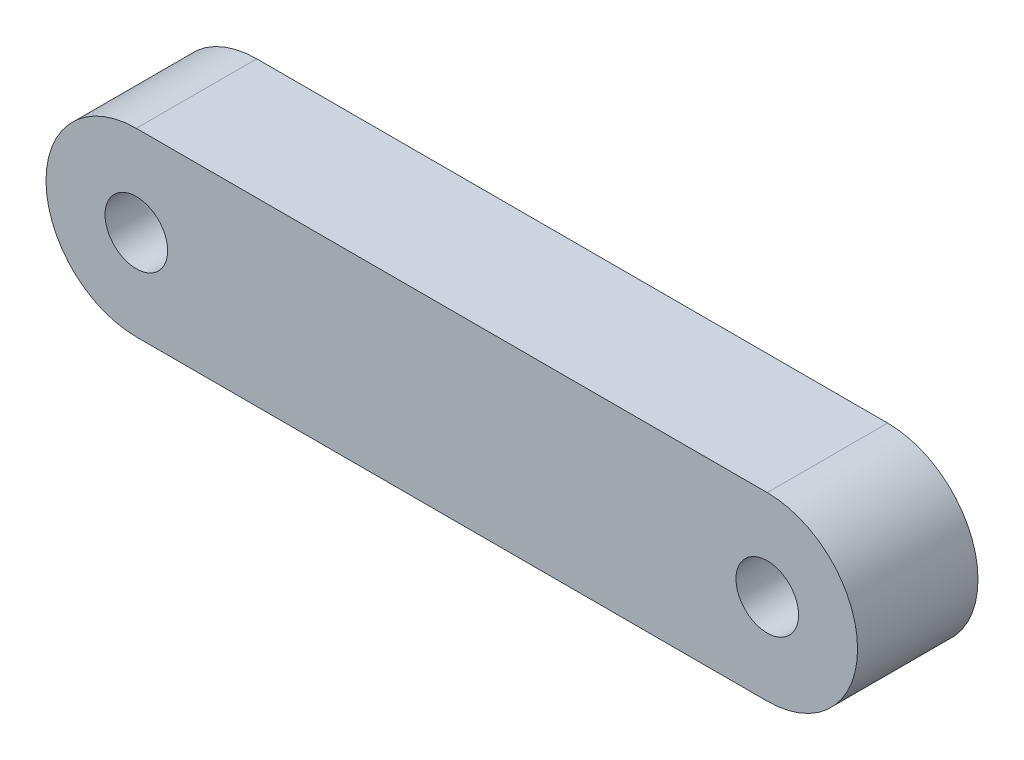
ISO-10303-21;
HEADER;
FILE_DESCRIPTION(('STEP AP214'),'2;1');
FILE_NAME('part.step','',(''),(''),'','','');
FILE_SCHEMA(('AUTOMOTIVE_DESIGN { 1 0 10303 214 1 1 1 1 }'));
ENDSEC;
DATA;
#1=APPLICATION_CONTEXT('core data for automotive mechanical design processes');
#2=APPLICATION_PROTOCOL_DEFINITION('international standard','automotive_design',2000,#1);
#3=PRODUCT_CONTEXT('',#1,'mechanical');
#4=PRODUCT('Part','Part','',(#3));
#5=PRODUCT_RELATED_PRODUCT_CATEGORY('part','',(#4));
#6=PRODUCT_DEFINITION_FORMATION('','',#4);
#7=PRODUCT_DEFINITION_CONTEXT('part definition',#1,'design');
#8=PRODUCT_DEFINITION('design','',#6,#7);
#9=PRODUCT_DEFINITION_SHAPE('','',#8);
#10=(LENGTH_UNIT() NAMED_UNIT(*) SI_UNIT(.MILLI.,.METRE.));
#11=(NAMED_UNIT(*) PLANE_ANGLE_UNIT() SI_UNIT($,.RADIAN.));
#12=(NAMED_UNIT(*) SI_UNIT($,.STERADIAN.) SOLID_ANGLE_UNIT());
#13=UNCERTAINTY_MEASURE_WITH_UNIT(LENGTH_MEASURE(1.E-05),#10,'distance_accuracy_value','');
#14=(GEOMETRIC_REPRESENTATION_CONTEXT(3) GLOBAL_UNCERTAINTY_ASSIGNED_CONTEXT((#13)) GLOBAL_UNIT_ASSIGNED_CONTEXT((#10,
#11,#12)) REPRESENTATION_CONTEXT('',''));
#15=CARTESIAN_POINT('',(0.,0.,0.));
#16=DIRECTION('',(0.,0.,1.));
#17=DIRECTION('',(1.,0.,0.));
#18=AXIS2_PLACEMENT_3D('',#15,#16,#17);
#19=CARTESIAN_POINT('',(-16.632351927,0.,6.35));
#20=DIRECTION('',(0.,0.,-1.));
#21=DIRECTION('',(-1.,0.,0.));
#22=AXIS2_PLACEMENT_3D('',#19,#20,#21);
#23=CYLINDRICAL_SURFACE('',#22,1.65);
#24=CARTESIAN_POINT('',(-16.632351927,0.,6.35));
#25=DIRECTION('',(0.,0.,1.));
#26=DIRECTION('',(1.,0.,0.));
#27=AXIS2_PLACEMENT_3D('',#24,#25,#26);
#28=CIRCLE('',#27,1.65);
#29=CARTESIAN_POINT('',(-14.982351927,0.,6.35));
#30=VERTEX_POINT('',#29);
#31=EDGE_CURVE('E159',#30,#30,#28,.T.);
#32=ORIENTED_EDGE('',*,*,#31,.T.);
#33=EDGE_LOOP('',(#32));
#34=FACE_BOUND('',#33,.T.);
#35=CARTESIAN_POINT('',(-16.632351927,0.,2.1));
#36=DIRECTION('',(0.,0.,-1.));
#37=DIRECTION('',(-1.,0.,0.));
#38=AXIS2_PLACEMENT_3D('',#35,#36,#37);
#39=CIRCLE('',#38,1.65);
#40=CARTESIAN_POINT('',(-18.282351927,0.,2.1));
#41=VERTEX_POINT('',#40);
#42=EDGE_CURVE('E157',#41,#41,#39,.T.);
#43=ORIENTED_EDGE('',*,*,#42,.T.);
#44=EDGE_LOOP('',(#43));
#45=FACE_BOUND('',#44,.T.);
#46=ADVANCED_FACE('F35',(#34,#45),#23,.F.);
#47=CARTESIAN_POINT('',(-16.632351927,0.,6.35));
#48=DIRECTION('',(0.,0.,1.));
#49=DIRECTION('',(1.,0.,0.));
#50=AXIS2_PLACEMENT_3D('',#47,#48,#49);
#51=PLANE('',#50);
#52=CARTESIAN_POINT('',(16.632351927,0.,6.35));
#53=DIRECTION('',(0.,0.,1.));
#54=DIRECTION('',(1.,0.,0.));
#55=AXIS2_PLACEMENT_3D('',#52,#53,#54);
#56=CIRCLE('',#55,1.65);
#57=CARTESIAN_POINT('',(18.282351927,0.,6.35));
#58=VERTEX_POINT('',#57);
#59=EDGE_CURVE('E231',#58,#58,#56,.T.);
#60=ORIENTED_EDGE('',*,*,#59,.F.);
#61=EDGE_LOOP('',(#60));
#62=FACE_BOUND('',#61,.T.);
#63=CARTESIAN_POINT('',(-16.632351927,0.,6.35));
#64=DIRECTION('',(0.,0.,1.));
#65=DIRECTION('',(1.,0.,0.));
#66=AXIS2_PLACEMENT_3D('',#63,#64,#65);
#67=CIRCLE('',#66,4.7625);
#68=CARTESIAN_POINT('',(-16.632351927,4.7625,6.35));
#69=VERTEX_POINT('',#68);
#70=CARTESIAN_POINT('',(-16.632351927,-4.7625,6.35));
#71=VERTEX_POINT('',#70);
#72=EDGE_CURVE('E134',#69,#71,#67,.T.);
#73=ORIENTED_EDGE('',*,*,#72,.T.);
#74=DIRECTION('',(1.,0.,0.));
#75=VECTOR('',#74,1.);
#76=CARTESIAN_POINT('',(-16.632351927,-4.7625,6.35));
#77=LINE('',#76,#75);
#78=CARTESIAN_POINT('',(16.632351927,-4.7625,6.35));
#79=VERTEX_POINT('',#78);
#80=EDGE_CURVE('E123',#71,#79,#77,.T.);
#81=ORIENTED_EDGE('',*,*,#80,.T.);
#82=CARTESIAN_POINT('',(16.632351927,0.,6.35));
#83=DIRECTION('',(0.,0.,1.));
#84=DIRECTION('',(1.,0.,0.));
#85=AXIS2_PLACEMENT_3D('',#82,#83,#84);
#86=CIRCLE('',#85,4.7625);
#87=CARTESIAN_POINT('',(16.632351927,4.7625,6.35));
#88=VERTEX_POINT('',#87);
#89=EDGE_CURVE('E133',#79,#88,#86,.T.);
#90=ORIENTED_EDGE('',*,*,#89,.T.);
#91=DIRECTION('',(-1.,0.,0.));
#92=VECTOR('',#91,1.);
#93=CARTESIAN_POINT('',(-16.632351927,4.7625,6.35));
#94=LINE('',#93,#92);
#95=EDGE_CURVE('E140',#88,#69,#94,.T.);
#96=ORIENTED_EDGE('',*,*,#95,.T.);
#97=EDGE_LOOP('',(#73,#81,#90,#96));
#98=FACE_BOUND('',#97,.T.);
#99=ORIENTED_EDGE('',*,*,#31,.F.);
#100=EDGE_LOOP('',(#99));
#101=FACE_BOUND('',#100,.T.);
#102=ADVANCED_FACE('F137',(#62,#98,#101),#51,.T.);
#103=CARTESIAN_POINT('',(-16.632351927,0.,0.));
#104=DIRECTION('',(0.,0.,1.));
#105=DIRECTION('',(1.,0.,0.));
#106=AXIS2_PLACEMENT_3D('',#103,#104,#105);
#107=PLANE('',#106);
#108=DIRECTION('',(0.707106781186548,0.707106781186547,0.));
#109=VECTOR('',#108,1.);
#110=CARTESIAN_POINT('',(-20.5921499016447,0.,0.));
#111=LINE('',#110,#109);
#112=CARTESIAN_POINT('',(-20.4125447792233,0.179605122421386,0.));
#113=VERTEX_POINT('',#112);
#114=CARTESIAN_POINT('',(-16.8119570494214,3.78019285222328,0.));
#115=VERTEX_POINT('',#114);
#116=EDGE_CURVE('E204',#113,#115,#111,.T.);
#117=ORIENTED_EDGE('',*,*,#116,.F.);
#118=CARTESIAN_POINT('',(-20.2329396568019,0.,0.));
#119=DIRECTION('',(0.,0.,1.));
#120=DIRECTION('',(1.,0.,0.));
#121=AXIS2_PLACEMENT_3D('',#118,#119,#120);
#122=CIRCLE('',#121,0.254);
#123=CARTESIAN_POINT('',(-20.4125447792233,-0.179605122421384,0.));
#124=VERTEX_POINT('',#123);
#125=EDGE_CURVE('E11',#113,#124,#122,.T.);
#126=ORIENTED_EDGE('',*,*,#125,.T.);
#127=DIRECTION('',(-0.707106781186548,0.707106781186547,0.));
#128=VECTOR('',#127,1.);
#129=CARTESIAN_POINT('',(-16.632351927,-3.95979797464467,0.));
#130=LINE('',#129,#128);
#131=CARTESIAN_POINT('',(-16.8119570494214,-3.78019285222328,0.));
#132=VERTEX_POINT('',#131);
#133=EDGE_CURVE('E222',#132,#124,#130,.T.);
#134=ORIENTED_EDGE('',*,*,#133,.F.);
#135=CARTESIAN_POINT('',(-16.632351927,-3.6005877298019,0.));
#136=DIRECTION('',(0.,0.,1.));
#137=DIRECTION('',(1.,0.,0.));
#138=AXIS2_PLACEMENT_3D('',#135,#136,#137);
#139=CIRCLE('',#138,0.254);
#140=CARTESIAN_POINT('',(-16.4527468045786,-3.78019285222328,0.));
#141=VERTEX_POINT('',#140);
#142=EDGE_CURVE('E186',#132,#141,#139,.T.);
#143=ORIENTED_EDGE('',*,*,#142,.T.);
#144=DIRECTION('',(-0.707106781186547,-0.707106781186548,0.));
#145=VECTOR('',#144,1.);
#146=CARTESIAN_POINT('',(-12.6725539523553,0.,0.));
#147=LINE('',#146,#145);
#148=CARTESIAN_POINT('',(-12.8521590747767,-0.179605122421382,0.));
#149=VERTEX_POINT('',#148);
#150=EDGE_CURVE('E195',#149,#141,#147,.T.);
#151=ORIENTED_EDGE('',*,*,#150,.F.);
#152=CARTESIAN_POINT('',(-13.0317641971981,0.,0.));
#153=DIRECTION('',(0.,0.,1.));
#154=DIRECTION('',(1.,0.,0.));
#155=AXIS2_PLACEMENT_3D('',#152,#153,#154);
#156=CIRCLE('',#155,0.254);
#157=CARTESIAN_POINT('',(-12.8521590747767,0.179605122421383,0.));
#158=VERTEX_POINT('',#157);
#159=EDGE_CURVE('E188',#149,#158,#156,.T.);
#160=ORIENTED_EDGE('',*,*,#159,.T.);
#161=DIRECTION('',(0.707106781186547,-0.707106781186548,0.));
#162=VECTOR('',#161,1.);
#163=CARTESIAN_POINT('',(-16.632351927,3.95979797464467,0.));
#164=LINE('',#163,#162);
#165=CARTESIAN_POINT('',(-16.4527468045786,3.78019285222328,0.));
#166=VERTEX_POINT('',#165);
#167=EDGE_CURVE('E193',#166,#158,#164,.T.);
#168=ORIENTED_EDGE('',*,*,#167,.F.);
#169=CARTESIAN_POINT('',(-16.632351927,3.6005877298019,0.));
#170=DIRECTION('',(0.,0.,1.));
#171=DIRECTION('',(1.,0.,0.));
#172=AXIS2_PLACEMENT_3D('',#169,#170,#171);
#173=CIRCLE('',#172,0.254);
#174=EDGE_CURVE('E43',#166,#115,#173,.T.);
#175=ORIENTED_EDGE('',*,*,#174,.T.);
#176=EDGE_LOOP('',(#117,#126,#134,#143,#151,#160,#168,#175));
#177=FACE_BOUND('',#176,.T.);
#178=CARTESIAN_POINT('',(-16.632351927,0.,0.));
#179=DIRECTION('',(0.,0.,1.));
#180=DIRECTION('',(1.,0.,0.));
#181=AXIS2_PLACEMENT_3D('',#178,#179,#180);
#182=CIRCLE('',#181,4.7625);
#183=CARTESIAN_POINT('',(-16.632351927,4.7625,0.));
#184=VERTEX_POINT('',#183);
#185=CARTESIAN_POINT('',(-16.632351927,-4.7625,0.));
#186=VERTEX_POINT('',#185);
#187=EDGE_CURVE('E148',#184,#186,#182,.T.);
#188=ORIENTED_EDGE('',*,*,#187,.F.);
#189=DIRECTION('',(-1.,0.,0.));
#190=VECTOR('',#189,1.);
#191=CARTESIAN_POINT('',(-16.632351927,4.7625,0.));
#192=LINE('',#191,#190);
#193=CARTESIAN_POINT('',(16.632351927,4.7625,0.));
#194=VERTEX_POINT('',#193);
#195=EDGE_CURVE('E144',#194,#184,#192,.T.);
#196=ORIENTED_EDGE('',*,*,#195,.F.);
#197=CARTESIAN_POINT('',(16.632351927,0.,0.));
#198=DIRECTION('',(0.,0.,1.));
#199=DIRECTION('',(1.,0.,0.));
#200=AXIS2_PLACEMENT_3D('',#197,#198,#199);
#201=CIRCLE('',#200,4.7625);
#202=CARTESIAN_POINT('',(16.632351927,-4.7625,0.));
#203=VERTEX_POINT('',#202);
#204=EDGE_CURVE('E242',#203,#194,#201,.T.);
#205=ORIENTED_EDGE('',*,*,#204,.F.);
#206=DIRECTION('',(1.,0.,0.));
#207=VECTOR('',#206,1.);
#208=CARTESIAN_POINT('',(-16.632351927,-4.7625,0.));
#209=LINE('',#208,#207);
#210=EDGE_CURVE('E240',#186,#203,#209,.T.);
#211=ORIENTED_EDGE('',*,*,#210,.F.);
#212=EDGE_LOOP('',(#188,#196,#205,#211));
#213=FACE_BOUND('',#212,.T.);
#214=CARTESIAN_POINT('',(16.632351927,0.,0.));
#215=DIRECTION('',(0.,0.,1.));
#216=DIRECTION('',(1.,0.,0.));
#217=AXIS2_PLACEMENT_3D('',#214,#215,#216);
#218=CIRCLE('',#217,1.65);
#219=CARTESIAN_POINT('',(18.282351927,0.,0.));
#220=VERTEX_POINT('',#219);
#221=EDGE_CURVE('E230',#220,#220,#218,.T.);
#222=ORIENTED_EDGE('',*,*,#221,.T.);
#223=EDGE_LOOP('',(#222));
#224=FACE_BOUND('',#223,.T.);
#225=ADVANCED_FACE('F191',(#177,#213,#224),#107,.F.);
#226=CARTESIAN_POINT('',(-16.632351927,0.,6.35));
#227=DIRECTION('',(0.,0.,-1.));
#228=DIRECTION('',(-1.,0.,0.));
#229=AXIS2_PLACEMENT_3D('',#226,#227,#228);
#230=CYLINDRICAL_SURFACE('',#229,4.7625);
#231=ORIENTED_EDGE('',*,*,#187,.T.);
#232=DIRECTION('',(0.,0.,-1.));
#233=VECTOR('',#232,1.);
#234=CARTESIAN_POINT('',(-16.632351927,-4.7625,6.35));
#235=LINE('',#234,#233);
#236=EDGE_CURVE('E127',#71,#186,#235,.T.);
#237=ORIENTED_EDGE('',*,*,#236,.F.);
#238=ORIENTED_EDGE('',*,*,#72,.F.);
#239=DIRECTION('',(0.,0.,-1.));
#240=VECTOR('',#239,1.);
#241=CARTESIAN_POINT('',(-16.632351927,4.7625,6.35));
#242=LINE('',#241,#240);
#243=EDGE_CURVE('E238',#69,#184,#242,.T.);
#244=ORIENTED_EDGE('',*,*,#243,.T.);
#245=EDGE_LOOP('',(#231,#237,#238,#244));
#246=FACE_BOUND('',#245,.T.);
#247=ADVANCED_FACE('F146',(#246),#230,.T.);
#248=CARTESIAN_POINT('',(-16.632351927,-4.7625,6.35));
#249=DIRECTION('',(0.,1.,0.));
#250=DIRECTION('',(0.,0.,1.));
#251=AXIS2_PLACEMENT_3D('',#248,#249,#250);
#252=PLANE('',#251);
#253=ORIENTED_EDGE('',*,*,#210,.T.);
#254=DIRECTION('',(0.,0.,-1.));
#255=VECTOR('',#254,1.);
#256=CARTESIAN_POINT('',(16.632351927,-4.7625,6.35));
#257=LINE('',#256,#255);
#258=EDGE_CURVE('E130',#79,#203,#257,.T.);
#259=ORIENTED_EDGE('',*,*,#258,.F.);
#260=ORIENTED_EDGE('',*,*,#80,.F.);
#261=ORIENTED_EDGE('',*,*,#236,.T.);
#262=EDGE_LOOP('',(#253,#259,#260,#261));
#263=FACE_BOUND('',#262,.T.);
#264=ADVANCED_FACE('F125',(#263),#252,.F.);
#265=CARTESIAN_POINT('',(16.632351927,0.,6.35));
#266=DIRECTION('',(0.,0.,-1.));
#267=DIRECTION('',(-1.,0.,0.));
#268=AXIS2_PLACEMENT_3D('',#265,#266,#267);
#269=CYLINDRICAL_SURFACE('',#268,4.7625);
#270=ORIENTED_EDGE('',*,*,#204,.T.);
#271=DIRECTION('',(0.,0.,-1.));
#272=VECTOR('',#271,1.);
#273=CARTESIAN_POINT('',(16.632351927,4.7625,6.35));
#274=LINE('',#273,#272);
#275=EDGE_CURVE('E153',#88,#194,#274,.T.);
#276=ORIENTED_EDGE('',*,*,#275,.F.);
#277=ORIENTED_EDGE('',*,*,#89,.F.);
#278=ORIENTED_EDGE('',*,*,#258,.T.);
#279=EDGE_LOOP('',(#270,#276,#277,#278));
#280=FACE_BOUND('',#279,.T.);
#281=ADVANCED_FACE('F253',(#280),#269,.T.);
#282=CARTESIAN_POINT('',(-16.632351927,4.7625,6.35));
#283=DIRECTION('',(0.,-1.,0.));
#284=DIRECTION('',(0.,0.,-1.));
#285=AXIS2_PLACEMENT_3D('',#282,#283,#284);
#286=PLANE('',#285);
#287=ORIENTED_EDGE('',*,*,#195,.T.);
#288=ORIENTED_EDGE('',*,*,#243,.F.);
#289=ORIENTED_EDGE('',*,*,#95,.F.);
#290=ORIENTED_EDGE('',*,*,#275,.T.);
#291=EDGE_LOOP('',(#287,#288,#289,#290));
#292=FACE_BOUND('',#291,.T.);
#293=ADVANCED_FACE('F249',(#292),#286,.F.);
#294=CARTESIAN_POINT('',(16.632351927,0.,6.35));
#295=DIRECTION('',(0.,0.,-1.));
#296=DIRECTION('',(-1.,0.,0.));
#297=AXIS2_PLACEMENT_3D('',#294,#295,#296);
#298=CYLINDRICAL_SURFACE('',#297,1.65);
#299=ORIENTED_EDGE('',*,*,#59,.T.);
#300=EDGE_LOOP('',(#299));
#301=FACE_BOUND('',#300,.T.);
#302=ORIENTED_EDGE('',*,*,#221,.F.);
#303=EDGE_LOOP('',(#302));
#304=FACE_BOUND('',#303,.T.);
#305=ADVANCED_FACE('F260',(#301,#304),#298,.F.);
#306=CARTESIAN_POINT('',(-16.632351927,-3.95979797464467,2.1));
#307=DIRECTION('',(-0.707106781186547,-0.707106781186548,0.));
#308=DIRECTION('',(0.707106781186548,-0.707106781186547,0.));
#309=AXIS2_PLACEMENT_3D('',#306,#307,#308);
#310=PLANE('',#309);
#311=DIRECTION('',(-0.707106781186548,0.707106781186547,0.));
#312=VECTOR('',#311,1.);
#313=CARTESIAN_POINT('',(-16.632351927,-3.95979797464467,2.1));
#314=LINE('',#313,#312);
#315=CARTESIAN_POINT('',(-16.8119570494214,-3.78019285222328,2.1));
#316=VERTEX_POINT('',#315);
#317=CARTESIAN_POINT('',(-20.4125447792233,-0.179605122421384,2.1));
#318=VERTEX_POINT('',#317);
#319=EDGE_CURVE('E227',#316,#318,#314,.T.);
#320=ORIENTED_EDGE('',*,*,#319,.F.);
#321=DIRECTION('',(0.,0.,-1.));
#322=VECTOR('',#321,1.);
#323=CARTESIAN_POINT('',(-16.8119570494214,-3.78019285222328,0.));
#324=LINE('',#323,#322);
#325=EDGE_CURVE('E151',#316,#132,#324,.T.);
#326=ORIENTED_EDGE('',*,*,#325,.T.);
#327=ORIENTED_EDGE('',*,*,#133,.T.);
#328=DIRECTION('',(0.,0.,-1.));
#329=VECTOR('',#328,1.);
#330=CARTESIAN_POINT('',(-20.4125447792233,-0.179605122421383,2.1));
#331=LINE('',#330,#329);
#332=EDGE_CURVE('E149',#124,#318,#331,.F.);
#333=ORIENTED_EDGE('',*,*,#332,.T.);
#334=EDGE_LOOP('',(#320,#326,#327,#333));
#335=FACE_BOUND('',#334,.T.);
#336=ADVANCED_FACE('F274',(#335),#310,.F.);
#337=CARTESIAN_POINT('',(-12.6725539523553,0.,2.1));
#338=DIRECTION('',(0.707106781186548,-0.707106781186547,0.));
#339=DIRECTION('',(0.707106781186547,0.707106781186548,0.));
#340=AXIS2_PLACEMENT_3D('',#337,#338,#339);
#341=PLANE('',#340);
#342=ORIENTED_EDGE('',*,*,#150,.T.);
#343=DIRECTION('',(0.,0.,-1.));
#344=VECTOR('',#343,1.);
#345=CARTESIAN_POINT('',(-16.4527468045786,-3.78019285222328,2.1));
#346=LINE('',#345,#344);
#347=CARTESIAN_POINT('',(-16.4527468045786,-3.78019285222328,2.1));
#348=VERTEX_POINT('',#347);
#349=EDGE_CURVE('E167',#141,#348,#346,.F.);
#350=ORIENTED_EDGE('',*,*,#349,.T.);
#351=DIRECTION('',(-0.707106781186547,-0.707106781186548,0.));
#352=VECTOR('',#351,1.);
#353=CARTESIAN_POINT('',(-12.6725539523553,0.,2.1));
#354=LINE('',#353,#352);
#355=CARTESIAN_POINT('',(-12.8521590747767,-0.179605122421382,2.1));
#356=VERTEX_POINT('',#355);
#357=EDGE_CURVE('E160',#356,#348,#354,.T.);
#358=ORIENTED_EDGE('',*,*,#357,.F.);
#359=DIRECTION('',(0.,0.,-1.));
#360=VECTOR('',#359,1.);
#361=CARTESIAN_POINT('',(-12.8521590747767,-0.179605122421382,0.));
#362=LINE('',#361,#360);
#363=EDGE_CURVE('E164',#356,#149,#362,.T.);
#364=ORIENTED_EDGE('',*,*,#363,.T.);
#365=EDGE_LOOP('',(#342,#350,#358,#364));
#366=FACE_BOUND('',#365,.T.);
#367=ADVANCED_FACE('F215',(#366),#341,.F.);
#368=CARTESIAN_POINT('',(-16.632351927,3.95979797464467,2.1));
#369=DIRECTION('',(0.707106781186548,0.707106781186547,0.));
#370=DIRECTION('',(-0.707106781186547,0.707106781186548,0.));
#371=AXIS2_PLACEMENT_3D('',#368,#369,#370);
#372=PLANE('',#371);
#373=ORIENTED_EDGE('',*,*,#167,.T.);
#374=DIRECTION('',(0.,0.,-1.));
#375=VECTOR('',#374,1.);
#376=CARTESIAN_POINT('',(-12.8521590747767,0.179605122421384,2.1));
#377=LINE('',#376,#375);
#378=CARTESIAN_POINT('',(-12.8521590747767,0.179605122421383,2.1));
#379=VERTEX_POINT('',#378);
#380=EDGE_CURVE('E180',#158,#379,#377,.F.);
#381=ORIENTED_EDGE('',*,*,#380,.T.);
#382=DIRECTION('',(0.707106781186547,-0.707106781186548,0.));
#383=VECTOR('',#382,1.);
#384=CARTESIAN_POINT('',(-16.632351927,3.95979797464467,2.1));
#385=LINE('',#384,#383);
#386=CARTESIAN_POINT('',(-16.4527468045786,3.78019285222328,2.1));
#387=VERTEX_POINT('',#386);
#388=EDGE_CURVE('E213',#387,#379,#385,.T.);
#389=ORIENTED_EDGE('',*,*,#388,.F.);
#390=DIRECTION('',(0.,0.,-1.));
#391=VECTOR('',#390,1.);
#392=CARTESIAN_POINT('',(-16.4527468045786,3.78019285222328,0.));
#393=LINE('',#392,#391);
#394=EDGE_CURVE('E177',#387,#166,#393,.T.);
#395=ORIENTED_EDGE('',*,*,#394,.T.);
#396=EDGE_LOOP('',(#373,#381,#389,#395));
#397=FACE_BOUND('',#396,.T.);
#398=ADVANCED_FACE('F200',(#397),#372,.F.);
#399=CARTESIAN_POINT('',(-20.5921499016447,0.,2.1));
#400=DIRECTION('',(-0.707106781186547,0.707106781186548,0.));
#401=DIRECTION('',(-0.707106781186548,-0.707106781186547,0.));
#402=AXIS2_PLACEMENT_3D('',#399,#400,#401);
#403=PLANE('',#402);
#404=ORIENTED_EDGE('',*,*,#116,.T.);
#405=DIRECTION('',(0.,0.,-1.));
#406=VECTOR('',#405,1.);
#407=CARTESIAN_POINT('',(-16.8119570494214,3.78019285222328,2.1));
#408=LINE('',#407,#406);
#409=CARTESIAN_POINT('',(-16.8119570494214,3.78019285222328,2.1));
#410=VERTEX_POINT('',#409);
#411=EDGE_CURVE('E184',#115,#410,#408,.F.);
#412=ORIENTED_EDGE('',*,*,#411,.T.);
#413=DIRECTION('',(0.707106781186548,0.707106781186547,0.));
#414=VECTOR('',#413,1.);
#415=CARTESIAN_POINT('',(-20.5921499016447,0.,2.1));
#416=LINE('',#415,#414);
#417=CARTESIAN_POINT('',(-20.4125447792233,0.179605122421386,2.1));
#418=VERTEX_POINT('',#417);
#419=EDGE_CURVE('E218',#418,#410,#416,.T.);
#420=ORIENTED_EDGE('',*,*,#419,.F.);
#421=DIRECTION('',(0.,0.,-1.));
#422=VECTOR('',#421,1.);
#423=CARTESIAN_POINT('',(-20.4125447792233,0.179605122421385,0.));
#424=LINE('',#423,#422);
#425=EDGE_CURVE('E182',#418,#113,#424,.T.);
#426=ORIENTED_EDGE('',*,*,#425,.T.);
#427=EDGE_LOOP('',(#404,#412,#420,#426));
#428=FACE_BOUND('',#427,.T.);
#429=ADVANCED_FACE('F309',(#428),#403,.F.);
#430=CARTESIAN_POINT('',(0.,0.,2.1));
#431=DIRECTION('',(0.,0.,-1.));
#432=DIRECTION('',(-1.,0.,0.));
#433=AXIS2_PLACEMENT_3D('',#430,#431,#432);
#434=PLANE('',#433);
#435=ORIENTED_EDGE('',*,*,#42,.F.);
#436=EDGE_LOOP('',(#435));
#437=FACE_BOUND('',#436,.T.);
#438=ORIENTED_EDGE('',*,*,#357,.T.);
#439=CARTESIAN_POINT('',(-16.632351927,-3.6005877298019,2.1));
#440=DIRECTION('',(0.,0.,-1.));
#441=DIRECTION('',(-1.,0.,0.));
#442=AXIS2_PLACEMENT_3D('',#439,#440,#441);
#443=CIRCLE('',#442,0.254);
#444=EDGE_CURVE('E175',#348,#316,#443,.T.);
#445=ORIENTED_EDGE('',*,*,#444,.T.);
#446=ORIENTED_EDGE('',*,*,#319,.T.);
#447=CARTESIAN_POINT('',(-20.2329396568019,0.,2.1));
#448=DIRECTION('',(0.,0.,-1.));
#449=DIRECTION('',(-1.,0.,0.));
#450=AXIS2_PLACEMENT_3D('',#447,#448,#449);
#451=CIRCLE('',#450,0.254);
#452=EDGE_CURVE('E169',#318,#418,#451,.T.);
#453=ORIENTED_EDGE('',*,*,#452,.T.);
#454=ORIENTED_EDGE('',*,*,#419,.T.);
#455=CARTESIAN_POINT('',(-16.632351927,3.6005877298019,2.1));
#456=DIRECTION('',(0.,0.,-1.));
#457=DIRECTION('',(-1.,0.,0.));
#458=AXIS2_PLACEMENT_3D('',#455,#456,#457);
#459=CIRCLE('',#458,0.254);
#460=EDGE_CURVE('E171',#410,#387,#459,.T.);
#461=ORIENTED_EDGE('',*,*,#460,.T.);
#462=ORIENTED_EDGE('',*,*,#388,.T.);
#463=CARTESIAN_POINT('',(-13.0317641971981,0.,2.1));
#464=DIRECTION('',(0.,0.,-1.));
#465=DIRECTION('',(-1.,0.,0.));
#466=AXIS2_PLACEMENT_3D('',#463,#464,#465);
#467=CIRCLE('',#466,0.254);
#468=EDGE_CURVE('E173',#379,#356,#467,.T.);
#469=ORIENTED_EDGE('',*,*,#468,.T.);
#470=EDGE_LOOP('',(#438,#445,#446,#453,#454,#461,#462,#469));
#471=FACE_BOUND('',#470,.T.);
#472=ADVANCED_FACE('F211',(#437,#471),#434,.T.);
#473=CARTESIAN_POINT('',(-16.632351927,-3.6005877298019,2.1));
#474=DIRECTION('',(0.,0.,1.));
#475=DIRECTION('',(1.,0.,0.));
#476=AXIS2_PLACEMENT_3D('',#473,#474,#475);
#477=CYLINDRICAL_SURFACE('',#476,0.254);
#478=ORIENTED_EDGE('',*,*,#444,.F.);
#479=ORIENTED_EDGE('',*,*,#349,.F.);
#480=ORIENTED_EDGE('',*,*,#142,.F.);
#481=ORIENTED_EDGE('',*,*,#325,.F.);
#482=EDGE_LOOP('',(#478,#479,#480,#481));
#483=FACE_BOUND('',#482,.T.);
#484=ADVANCED_FACE('F287',(#483),#477,.F.);
#485=CARTESIAN_POINT('',(-13.0317641971981,0.,2.1));
#486=DIRECTION('',(0.,0.,1.));
#487=DIRECTION('',(1.,0.,0.));
#488=AXIS2_PLACEMENT_3D('',#485,#486,#487);
#489=CYLINDRICAL_SURFACE('',#488,0.254);
#490=ORIENTED_EDGE('',*,*,#468,.F.);
#491=ORIENTED_EDGE('',*,*,#380,.F.);
#492=ORIENTED_EDGE('',*,*,#159,.F.);
#493=ORIENTED_EDGE('',*,*,#363,.F.);
#494=EDGE_LOOP('',(#490,#491,#492,#493));
#495=FACE_BOUND('',#494,.T.);
#496=ADVANCED_FACE('F207',(#495),#489,.F.);
#497=CARTESIAN_POINT('',(-16.632351927,3.6005877298019,2.1));
#498=DIRECTION('',(0.,0.,1.));
#499=DIRECTION('',(1.,0.,0.));
#500=AXIS2_PLACEMENT_3D('',#497,#498,#499);
#501=CYLINDRICAL_SURFACE('',#500,0.254);
#502=ORIENTED_EDGE('',*,*,#460,.F.);
#503=ORIENTED_EDGE('',*,*,#411,.F.);
#504=ORIENTED_EDGE('',*,*,#174,.F.);
#505=ORIENTED_EDGE('',*,*,#394,.F.);
#506=EDGE_LOOP('',(#502,#503,#504,#505));
#507=FACE_BOUND('',#506,.T.);
#508=ADVANCED_FACE('F292',(#507),#501,.F.);
#509=CARTESIAN_POINT('',(-20.2329396568019,0.,2.1));
#510=DIRECTION('',(0.,0.,1.));
#511=DIRECTION('',(1.,0.,0.));
#512=AXIS2_PLACEMENT_3D('',#509,#510,#511);
#513=CYLINDRICAL_SURFACE('',#512,0.254);
#514=ORIENTED_EDGE('',*,*,#452,.F.);
#515=ORIENTED_EDGE('',*,*,#332,.F.);
#516=ORIENTED_EDGE('',*,*,#125,.F.);
#517=ORIENTED_EDGE('',*,*,#425,.F.);
#518=EDGE_LOOP('',(#514,#515,#516,#517));
#519=FACE_BOUND('',#518,.T.);
#520=ADVANCED_FACE('F37',(#519),#513,.F.);
#521=CLOSED_SHELL('',(#46,#102,#225,#247,#264,#281,#293,#305,#336,#367,#398,#429,#472,#484,#496,
#508,#520));
#522=MANIFOLD_SOLID_BREP('B2',#521);
#523=ADVANCED_BREP_SHAPE_REPRESENTATION('',(#18,#522),#14);
#524=SHAPE_DEFINITION_REPRESENTATION(#9,#523);
ENDSEC;
END-ISO-10303-21;
